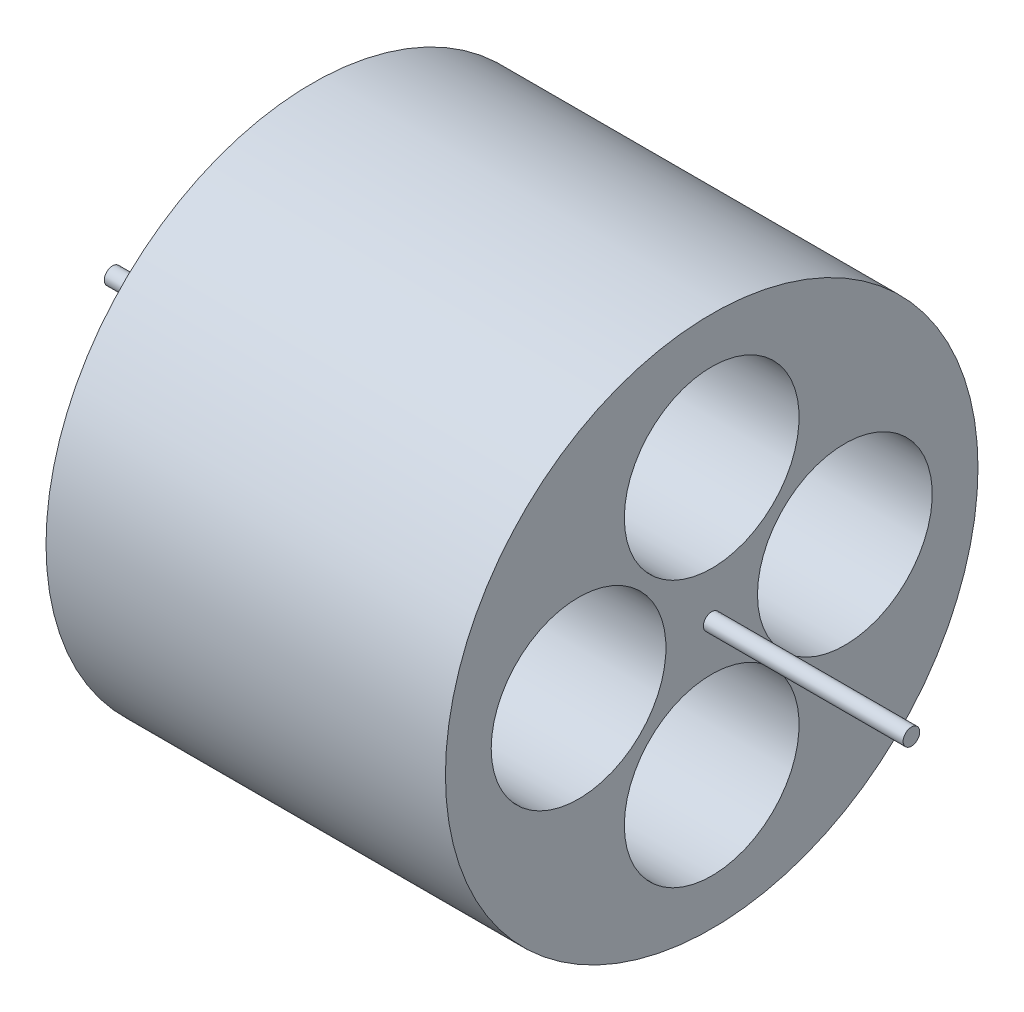
ISO-10303-21;
HEADER;
FILE_DESCRIPTION(('STEP AP214'),'2;1');
FILE_NAME('part.step','',(''),(''),'','','');
FILE_SCHEMA(('AUTOMOTIVE_DESIGN { 1 0 10303 214 1 1 1 1 }'));
ENDSEC;
DATA;
#1=APPLICATION_CONTEXT('core data for automotive mechanical design processes');
#2=APPLICATION_PROTOCOL_DEFINITION('international standard','automotive_design',2000,#1);
#3=PRODUCT_CONTEXT('',#1,'mechanical');
#4=PRODUCT('Part','Part','',(#3));
#5=PRODUCT_RELATED_PRODUCT_CATEGORY('part','',(#4));
#6=PRODUCT_DEFINITION_FORMATION('','',#4);
#7=PRODUCT_DEFINITION_CONTEXT('part definition',#1,'design');
#8=PRODUCT_DEFINITION('design','',#6,#7);
#9=PRODUCT_DEFINITION_SHAPE('','',#8);
#10=(LENGTH_UNIT() NAMED_UNIT(*) SI_UNIT(.MILLI.,.METRE.));
#11=(NAMED_UNIT(*) PLANE_ANGLE_UNIT() SI_UNIT($,.RADIAN.));
#12=(NAMED_UNIT(*) SI_UNIT($,.STERADIAN.) SOLID_ANGLE_UNIT());
#13=UNCERTAINTY_MEASURE_WITH_UNIT(LENGTH_MEASURE(1.E-05),#10,'distance_accuracy_value','');
#14=(GEOMETRIC_REPRESENTATION_CONTEXT(3) GLOBAL_UNCERTAINTY_ASSIGNED_CONTEXT((#13)) GLOBAL_UNIT_ASSIGNED_CONTEXT((#10,
#11,#12)) REPRESENTATION_CONTEXT('',''));
#15=CARTESIAN_POINT('',(0.,0.,0.));
#16=DIRECTION('',(0.,0.,1.));
#17=DIRECTION('',(1.,0.,0.));
#18=AXIS2_PLACEMENT_3D('',#15,#16,#17);
#19=CARTESIAN_POINT('',(152.4,0.,0.));
#20=DIRECTION('',(-1.,0.,0.));
#21=DIRECTION('',(0.,0.,1.));
#22=AXIS2_PLACEMENT_3D('',#19,#20,#21);
#23=CYLINDRICAL_SURFACE('',#22,101.6);
#24=CARTESIAN_POINT('',(152.4,0.,0.));
#25=DIRECTION('',(1.,0.,0.));
#26=DIRECTION('',(0.,0.,-1.));
#27=AXIS2_PLACEMENT_3D('',#24,#25,#26);
#28=CIRCLE('',#27,101.6);
#29=CARTESIAN_POINT('',(152.4,0.,101.6));
#30=VERTEX_POINT('',#29);
#31=EDGE_CURVE('E39',#30,#30,#28,.T.);
#32=CARTESIAN_POINT('',(0.,0.,0.));
#33=DIRECTION('',(1.,0.,0.));
#34=DIRECTION('',(0.,0.,-1.));
#35=AXIS2_PLACEMENT_3D('',#32,#33,#34);
#36=CIRCLE('',#35,101.6);
#37=CARTESIAN_POINT('',(0.,0.,101.6));
#38=VERTEX_POINT('',#37);
#39=EDGE_CURVE('E43',#38,#38,#36,.T.);
#40=CARTESIAN_POINT('',(152.4,0.,101.6));
#41=CARTESIAN_POINT('',(150.8125,0.,101.6));
#42=CARTESIAN_POINT('',(149.225,0.,101.6));
#43=CARTESIAN_POINT('',(146.05,0.,101.6));
#44=CARTESIAN_POINT('',(144.4625,0.,101.6));
#45=CARTESIAN_POINT('',(141.2875,0.,101.6));
#46=CARTESIAN_POINT('',(139.7,0.,101.6));
#47=CARTESIAN_POINT('',(136.525,0.,101.6));
#48=CARTESIAN_POINT('',(134.9375,0.,101.6));
#49=CARTESIAN_POINT('',(131.7625,0.,101.6));
#50=CARTESIAN_POINT('',(130.175,0.,101.6));
#51=CARTESIAN_POINT('',(127.,0.,101.6));
#52=CARTESIAN_POINT('',(125.4125,0.,101.6));
#53=CARTESIAN_POINT('',(122.2375,0.,101.6));
#54=CARTESIAN_POINT('',(120.65,0.,101.6));
#55=CARTESIAN_POINT('',(117.475,0.,101.6));
#56=CARTESIAN_POINT('',(115.8875,0.,101.6));
#57=CARTESIAN_POINT('',(112.7125,0.,101.6));
#58=CARTESIAN_POINT('',(111.125,0.,101.6));
#59=CARTESIAN_POINT('',(107.95,0.,101.6));
#60=CARTESIAN_POINT('',(106.3625,0.,101.6));
#61=CARTESIAN_POINT('',(103.1875,0.,101.6));
#62=CARTESIAN_POINT('',(101.6,0.,101.6));
#63=CARTESIAN_POINT('',(98.425,0.,101.6));
#64=CARTESIAN_POINT('',(96.8375,0.,101.6));
#65=CARTESIAN_POINT('',(93.6625,0.,101.6));
#66=CARTESIAN_POINT('',(92.075,0.,101.6));
#67=CARTESIAN_POINT('',(88.9,0.,101.6));
#68=CARTESIAN_POINT('',(87.3125,0.,101.6));
#69=CARTESIAN_POINT('',(84.1375,0.,101.6));
#70=CARTESIAN_POINT('',(82.55,0.,101.6));
#71=CARTESIAN_POINT('',(79.375,0.,101.6));
#72=CARTESIAN_POINT('',(77.7875,0.,101.6));
#73=CARTESIAN_POINT('',(74.6125,0.,101.6));
#74=CARTESIAN_POINT('',(73.025,0.,101.6));
#75=CARTESIAN_POINT('',(69.85,0.,101.6));
#76=CARTESIAN_POINT('',(68.2625,0.,101.6));
#77=CARTESIAN_POINT('',(65.0875,0.,101.6));
#78=CARTESIAN_POINT('',(63.5,0.,101.6));
#79=CARTESIAN_POINT('',(60.325,0.,101.6));
#80=CARTESIAN_POINT('',(58.7375,0.,101.6));
#81=CARTESIAN_POINT('',(55.5625,0.,101.6));
#82=CARTESIAN_POINT('',(53.975,0.,101.6));
#83=CARTESIAN_POINT('',(50.8,0.,101.6));
#84=CARTESIAN_POINT('',(49.2125,0.,101.6));
#85=CARTESIAN_POINT('',(46.0375,0.,101.6));
#86=CARTESIAN_POINT('',(44.45,0.,101.6));
#87=CARTESIAN_POINT('',(41.275,0.,101.6));
#88=CARTESIAN_POINT('',(39.6875,0.,101.6));
#89=CARTESIAN_POINT('',(36.5125,0.,101.6));
#90=CARTESIAN_POINT('',(34.925,0.,101.6));
#91=CARTESIAN_POINT('',(31.75,0.,101.6));
#92=CARTESIAN_POINT('',(30.1625,0.,101.6));
#93=CARTESIAN_POINT('',(26.9875,0.,101.6));
#94=CARTESIAN_POINT('',(25.4,0.,101.6));
#95=CARTESIAN_POINT('',(22.225,0.,101.6));
#96=CARTESIAN_POINT('',(20.6375,0.,101.6));
#97=CARTESIAN_POINT('',(17.4625,0.,101.6));
#98=CARTESIAN_POINT('',(15.875,0.,101.6));
#99=CARTESIAN_POINT('',(12.7,0.,101.6));
#100=CARTESIAN_POINT('',(11.1125,0.,101.6));
#101=CARTESIAN_POINT('',(7.93750000000001,0.,101.6));
#102=CARTESIAN_POINT('',(6.35,0.,101.6));
#103=CARTESIAN_POINT('',(3.175,0.,101.6));
#104=CARTESIAN_POINT('',(1.5875,0.,101.6));
#105=CARTESIAN_POINT('',(0.,0.,101.6));
#106=B_SPLINE_CURVE_WITH_KNOTS('',3,(#40,#41,#42,#43,#44,#45,#46,#47,#48,#49,#50,#51,#52,#53,
#54,#55,#56,#57,#58,#59,#60,#61,#62,#63,#64,#65,#66,#67,#68,#69,#70,#71,#72,#73,#74,#75,#76,#77,
#78,#79,#80,#81,#82,#83,#84,#85,#86,#87,#88,#89,#90,#91,#92,#93,#94,#95,#96,#97,#98,#99,#100,
#101,#102,#103,#104,#105),.UNSPECIFIED.,.F.,.F.,(4,2,2,2,2,2,2,2,2,2,2,2,2,2,2,2,2,2,2,2,2,2,2,
2,2,2,2,2,2,2,2,2,4),(0.,4.76249999999998,9.52499999999998,14.2875,19.05,23.8125,28.575,33.3375,
38.1,42.8625,47.625,52.3875,57.15,61.9125,66.675,71.4375,76.2,80.9625,85.725,90.4875,95.25,
100.0125,104.775,109.5375,114.3,119.0625,123.825,128.5875,133.35,138.1125,142.875,147.6375,
152.4),.UNSPECIFIED.);
#107=EDGE_CURVE('BSEAM33',#30,#38,#106,.T.);
#108=ORIENTED_EDGE('',*,*,#31,.F.);
#109=ORIENTED_EDGE('',*,*,#39,.T.);
#110=ORIENTED_EDGE('',*,*,#107,.T.);
#111=ORIENTED_EDGE('',*,*,#107,.F.);
#112=EDGE_LOOP('',(#108,#110,#109,#111));
#113=FACE_BOUND('',#112,.T.);
#114=ADVANCED_FACE('F33',(#113),#23,.T.);
#115=CARTESIAN_POINT('',(152.4,0.,0.));
#116=DIRECTION('',(1.,0.,0.));
#117=DIRECTION('',(0.,0.,-1.));
#118=AXIS2_PLACEMENT_3D('',#115,#116,#117);
#119=PLANE('',#118);
#120=CARTESIAN_POINT('',(152.4,0.,0.));
#121=DIRECTION('',(1.,0.,0.));
#122=DIRECTION('',(0.,0.,-1.));
#123=AXIS2_PLACEMENT_3D('',#120,#121,#122);
#124=CIRCLE('',#123,3.175);
#125=CARTESIAN_POINT('',(152.4,0.,-3.175));
#126=VERTEX_POINT('',#125);
#127=EDGE_CURVE('E71',#126,#126,#124,.F.);
#128=ORIENTED_EDGE('',*,*,#127,.T.);
#129=EDGE_LOOP('',(#128));
#130=FACE_BOUND('',#129,.T.);
#131=CARTESIAN_POINT('',(152.4,0.,50.8));
#132=DIRECTION('',(1.,0.,0.));
#133=DIRECTION('',(0.,0.,1.));
#134=AXIS2_PLACEMENT_3D('',#131,#132,#133);
#135=CIRCLE('',#134,33.3375);
#136=CARTESIAN_POINT('',(152.4,0.,84.1375));
#137=VERTEX_POINT('',#136);
#138=EDGE_CURVE('E59',#137,#137,#135,.T.);
#139=ORIENTED_EDGE('',*,*,#138,.F.);
#140=EDGE_LOOP('',(#139));
#141=FACE_BOUND('',#140,.T.);
#142=CARTESIAN_POINT('',(152.4,-50.8,-5.32101756039693E-13));
#143=DIRECTION('',(1.,0.,0.));
#144=DIRECTION('',(0.,-1.,0.));
#145=AXIS2_PLACEMENT_3D('',#142,#143,#144);
#146=CIRCLE('',#145,33.3375);
#147=CARTESIAN_POINT('',(152.4,-50.8,33.3374999999995));
#148=VERTEX_POINT('',#147);
#149=EDGE_CURVE('E65',#148,#148,#146,.T.);
#150=ORIENTED_EDGE('',*,*,#149,.F.);
#151=EDGE_LOOP('',(#150));
#152=FACE_BOUND('',#151,.T.);
#153=CARTESIAN_POINT('',(152.4,50.8,1.77367252013231E-13));
#154=DIRECTION('',(1.,0.,0.));
#155=DIRECTION('',(0.,1.,0.));
#156=AXIS2_PLACEMENT_3D('',#153,#154,#155);
#157=CIRCLE('',#156,33.3375);
#158=CARTESIAN_POINT('',(152.4,50.8,33.3375000000002));
#159=VERTEX_POINT('',#158);
#160=EDGE_CURVE('E53',#159,#159,#157,.T.);
#161=ORIENTED_EDGE('',*,*,#160,.F.);
#162=EDGE_LOOP('',(#161));
#163=FACE_BOUND('',#162,.T.);
#164=CARTESIAN_POINT('',(152.4,0.,-50.8));
#165=DIRECTION('',(1.,0.,0.));
#166=DIRECTION('',(0.,0.,-1.));
#167=AXIS2_PLACEMENT_3D('',#164,#165,#166);
#168=CIRCLE('',#167,33.3375);
#169=CARTESIAN_POINT('',(152.4,0.,-17.4625));
#170=VERTEX_POINT('',#169);
#171=EDGE_CURVE('E48',#170,#170,#168,.T.);
#172=ORIENTED_EDGE('',*,*,#171,.F.);
#173=EDGE_LOOP('',(#172));
#174=FACE_BOUND('',#173,.T.);
#175=ORIENTED_EDGE('',*,*,#31,.T.);
#176=EDGE_LOOP('',(#175));
#177=FACE_BOUND('',#176,.T.);
#178=ADVANCED_FACE('F100',(#130,#141,#152,#163,#174,#177),#119,.T.);
#179=CARTESIAN_POINT('',(0.,0.,0.));
#180=DIRECTION('',(1.,0.,0.));
#181=DIRECTION('',(0.,0.,-1.));
#182=AXIS2_PLACEMENT_3D('',#179,#180,#181);
#183=PLANE('',#182);
#184=CARTESIAN_POINT('',(0.,0.,0.));
#185=DIRECTION('',(1.,0.,0.));
#186=DIRECTION('',(0.,0.,-1.));
#187=AXIS2_PLACEMENT_3D('',#184,#185,#186);
#188=CIRCLE('',#187,3.175);
#189=CARTESIAN_POINT('',(0.,0.,-3.175));
#190=VERTEX_POINT('',#189);
#191=EDGE_CURVE('E10',#190,#190,#188,.F.);
#192=ORIENTED_EDGE('',*,*,#191,.F.);
#193=EDGE_LOOP('',(#192));
#194=FACE_BOUND('',#193,.T.);
#195=CARTESIAN_POINT('',(0.,0.,50.8));
#196=DIRECTION('',(1.,0.,0.));
#197=DIRECTION('',(0.,0.,1.));
#198=AXIS2_PLACEMENT_3D('',#195,#196,#197);
#199=CIRCLE('',#198,33.3375);
#200=CARTESIAN_POINT('',(0.,0.,84.1375));
#201=VERTEX_POINT('',#200);
#202=EDGE_CURVE('E62',#201,#201,#199,.T.);
#203=ORIENTED_EDGE('',*,*,#202,.T.);
#204=EDGE_LOOP('',(#203));
#205=FACE_BOUND('',#204,.T.);
#206=CARTESIAN_POINT('',(0.,-50.8,-5.32101756039693E-13));
#207=DIRECTION('',(1.,0.,0.));
#208=DIRECTION('',(0.,-1.,0.));
#209=AXIS2_PLACEMENT_3D('',#206,#207,#208);
#210=CIRCLE('',#209,33.3375);
#211=CARTESIAN_POINT('',(0.,-50.8,33.3374999999995));
#212=VERTEX_POINT('',#211);
#213=EDGE_CURVE('E68',#212,#212,#210,.T.);
#214=ORIENTED_EDGE('',*,*,#213,.T.);
#215=EDGE_LOOP('',(#214));
#216=FACE_BOUND('',#215,.T.);
#217=CARTESIAN_POINT('',(0.,50.8,1.77367252013231E-13));
#218=DIRECTION('',(1.,0.,0.));
#219=DIRECTION('',(0.,1.,0.));
#220=AXIS2_PLACEMENT_3D('',#217,#218,#219);
#221=CIRCLE('',#220,33.3375);
#222=CARTESIAN_POINT('',(0.,50.8,33.3375000000002));
#223=VERTEX_POINT('',#222);
#224=EDGE_CURVE('E56',#223,#223,#221,.T.);
#225=ORIENTED_EDGE('',*,*,#224,.T.);
#226=EDGE_LOOP('',(#225));
#227=FACE_BOUND('',#226,.T.);
#228=CARTESIAN_POINT('',(0.,0.,-50.8));
#229=DIRECTION('',(1.,0.,0.));
#230=DIRECTION('',(0.,0.,-1.));
#231=AXIS2_PLACEMENT_3D('',#228,#229,#230);
#232=CIRCLE('',#231,33.3375);
#233=CARTESIAN_POINT('',(0.,0.,-17.4625));
#234=VERTEX_POINT('',#233);
#235=EDGE_CURVE('E50',#234,#234,#232,.T.);
#236=ORIENTED_EDGE('',*,*,#235,.T.);
#237=EDGE_LOOP('',(#236));
#238=FACE_BOUND('',#237,.T.);
#239=ORIENTED_EDGE('',*,*,#39,.F.);
#240=EDGE_LOOP('',(#239));
#241=FACE_BOUND('',#240,.T.);
#242=ADVANCED_FACE('F105',(#194,#205,#216,#227,#238,#241),#183,.F.);
#243=CARTESIAN_POINT('',(152.4,0.,-50.8));
#244=DIRECTION('',(-1.,0.,0.));
#245=DIRECTION('',(0.,0.,1.));
#246=AXIS2_PLACEMENT_3D('',#243,#244,#245);
#247=CYLINDRICAL_SURFACE('',#246,33.3375);
#248=CARTESIAN_POINT('',(152.4,0.,-17.4625));
#249=CARTESIAN_POINT('',(150.8125,0.,-17.4625));
#250=CARTESIAN_POINT('',(149.225,0.,-17.4625));
#251=CARTESIAN_POINT('',(146.05,0.,-17.4625));
#252=CARTESIAN_POINT('',(144.4625,0.,-17.4625));
#253=CARTESIAN_POINT('',(141.2875,0.,-17.4625));
#254=CARTESIAN_POINT('',(139.7,0.,-17.4625));
#255=CARTESIAN_POINT('',(136.525,0.,-17.4625));
#256=CARTESIAN_POINT('',(134.9375,0.,-17.4625));
#257=CARTESIAN_POINT('',(131.7625,0.,-17.4625));
#258=CARTESIAN_POINT('',(130.175,0.,-17.4625));
#259=CARTESIAN_POINT('',(127.,0.,-17.4625));
#260=CARTESIAN_POINT('',(125.4125,0.,-17.4625));
#261=CARTESIAN_POINT('',(122.2375,0.,-17.4625));
#262=CARTESIAN_POINT('',(120.65,0.,-17.4625));
#263=CARTESIAN_POINT('',(117.475,0.,-17.4625));
#264=CARTESIAN_POINT('',(115.8875,0.,-17.4625));
#265=CARTESIAN_POINT('',(112.7125,0.,-17.4625));
#266=CARTESIAN_POINT('',(111.125,0.,-17.4625));
#267=CARTESIAN_POINT('',(107.95,0.,-17.4625));
#268=CARTESIAN_POINT('',(106.3625,0.,-17.4625));
#269=CARTESIAN_POINT('',(103.1875,0.,-17.4625));
#270=CARTESIAN_POINT('',(101.6,0.,-17.4625));
#271=CARTESIAN_POINT('',(98.425,0.,-17.4625));
#272=CARTESIAN_POINT('',(96.8375,0.,-17.4625));
#273=CARTESIAN_POINT('',(93.6625,0.,-17.4625));
#274=CARTESIAN_POINT('',(92.075,0.,-17.4625));
#275=CARTESIAN_POINT('',(88.9,0.,-17.4625));
#276=CARTESIAN_POINT('',(87.3125,0.,-17.4625));
#277=CARTESIAN_POINT('',(84.1375,0.,-17.4625));
#278=CARTESIAN_POINT('',(82.55,0.,-17.4625));
#279=CARTESIAN_POINT('',(79.375,0.,-17.4625));
#280=CARTESIAN_POINT('',(77.7875,0.,-17.4625));
#281=CARTESIAN_POINT('',(74.6125,0.,-17.4625));
#282=CARTESIAN_POINT('',(73.025,0.,-17.4625));
#283=CARTESIAN_POINT('',(69.85,0.,-17.4625));
#284=CARTESIAN_POINT('',(68.2625,0.,-17.4625));
#285=CARTESIAN_POINT('',(65.0875,0.,-17.4625));
#286=CARTESIAN_POINT('',(63.5,0.,-17.4625));
#287=CARTESIAN_POINT('',(60.325,0.,-17.4625));
#288=CARTESIAN_POINT('',(58.7375,0.,-17.4625));
#289=CARTESIAN_POINT('',(55.5625,0.,-17.4625));
#290=CARTESIAN_POINT('',(53.975,0.,-17.4625));
#291=CARTESIAN_POINT('',(50.8,0.,-17.4625));
#292=CARTESIAN_POINT('',(49.2125,0.,-17.4625));
#293=CARTESIAN_POINT('',(46.0375,0.,-17.4625));
#294=CARTESIAN_POINT('',(44.45,0.,-17.4625));
#295=CARTESIAN_POINT('',(41.275,0.,-17.4625));
#296=CARTESIAN_POINT('',(39.6875,0.,-17.4625));
#297=CARTESIAN_POINT('',(36.5125,0.,-17.4625));
#298=CARTESIAN_POINT('',(34.925,0.,-17.4625));
#299=CARTESIAN_POINT('',(31.75,0.,-17.4625));
#300=CARTESIAN_POINT('',(30.1625,0.,-17.4625));
#301=CARTESIAN_POINT('',(26.9875,0.,-17.4625));
#302=CARTESIAN_POINT('',(25.4,0.,-17.4625));
#303=CARTESIAN_POINT('',(22.225,0.,-17.4625));
#304=CARTESIAN_POINT('',(20.6375,0.,-17.4625));
#305=CARTESIAN_POINT('',(17.4625,0.,-17.4625));
#306=CARTESIAN_POINT('',(15.875,0.,-17.4625));
#307=CARTESIAN_POINT('',(12.7,0.,-17.4625));
#308=CARTESIAN_POINT('',(11.1125,0.,-17.4625));
#309=CARTESIAN_POINT('',(7.93750000000001,0.,-17.4625));
#310=CARTESIAN_POINT('',(6.35,0.,-17.4625));
#311=CARTESIAN_POINT('',(3.175,0.,-17.4625));
#312=CARTESIAN_POINT('',(1.5875,0.,-17.4625));
#313=CARTESIAN_POINT('',(0.,0.,-17.4625));
#314=B_SPLINE_CURVE_WITH_KNOTS('',3,(#248,#249,#250,#251,#252,#253,#254,#255,#256,#257,#258,
#259,#260,#261,#262,#263,#264,#265,#266,#267,#268,#269,#270,#271,#272,#273,#274,#275,#276,#277,
#278,#279,#280,#281,#282,#283,#284,#285,#286,#287,#288,#289,#290,#291,#292,#293,#294,#295,#296,
#297,#298,#299,#300,#301,#302,#303,#304,#305,#306,#307,#308,#309,#310,#311,#312,#313),
.UNSPECIFIED.,.F.,.F.,(4,2,2,2,2,2,2,2,2,2,2,2,2,2,2,2,2,2,2,2,2,2,2,2,2,2,2,2,2,2,2,2,4),(0.,
4.7625,9.52500000000001,14.2875,19.05,23.8125,28.575,33.3375,38.1,42.8625,47.625,52.3875,57.15,
61.9125,66.675,71.4375,76.2,80.9625,85.725,90.4875,95.25,100.0125,104.775,109.5375,114.3,
119.0625,123.825,128.5875,133.35,138.1125,142.875,147.6375,152.4),.UNSPECIFIED.);
#315=EDGE_CURVE('BSEAM112',#170,#234,#314,.T.);
#316=ORIENTED_EDGE('',*,*,#171,.T.);
#317=ORIENTED_EDGE('',*,*,#235,.F.);
#318=ORIENTED_EDGE('',*,*,#315,.T.);
#319=ORIENTED_EDGE('',*,*,#315,.F.);
#320=EDGE_LOOP('',(#316,#318,#317,#319));
#321=FACE_BOUND('',#320,.T.);
#322=ADVANCED_FACE('F112',(#321),#247,.F.);
#323=CARTESIAN_POINT('',(152.4,50.8,1.77367252013231E-13));
#324=DIRECTION('',(-1.,0.,0.));
#325=DIRECTION('',(0.,0.,1.));
#326=AXIS2_PLACEMENT_3D('',#323,#324,#325);
#327=CYLINDRICAL_SURFACE('',#326,33.3375);
#328=CARTESIAN_POINT('',(152.4,50.8,33.3375000000002));
#329=CARTESIAN_POINT('',(150.8125,50.8,33.3375000000002));
#330=CARTESIAN_POINT('',(149.225,50.8,33.3375000000002));
#331=CARTESIAN_POINT('',(146.05,50.8,33.3375000000002));
#332=CARTESIAN_POINT('',(144.4625,50.8,33.3375000000002));
#333=CARTESIAN_POINT('',(141.2875,50.8,33.3375000000002));
#334=CARTESIAN_POINT('',(139.7,50.8,33.3375000000002));
#335=CARTESIAN_POINT('',(136.525,50.8,33.3375000000002));
#336=CARTESIAN_POINT('',(134.9375,50.8,33.3375000000002));
#337=CARTESIAN_POINT('',(131.7625,50.8,33.3375000000002));
#338=CARTESIAN_POINT('',(130.175,50.8,33.3375000000002));
#339=CARTESIAN_POINT('',(127.,50.8,33.3375000000002));
#340=CARTESIAN_POINT('',(125.4125,50.8,33.3375000000002));
#341=CARTESIAN_POINT('',(122.2375,50.8,33.3375000000002));
#342=CARTESIAN_POINT('',(120.65,50.8,33.3375000000002));
#343=CARTESIAN_POINT('',(117.475,50.8,33.3375000000002));
#344=CARTESIAN_POINT('',(115.8875,50.8,33.3375000000002));
#345=CARTESIAN_POINT('',(112.7125,50.8,33.3375000000002));
#346=CARTESIAN_POINT('',(111.125,50.8,33.3375000000002));
#347=CARTESIAN_POINT('',(107.95,50.8,33.3375000000002));
#348=CARTESIAN_POINT('',(106.3625,50.8,33.3375000000002));
#349=CARTESIAN_POINT('',(103.1875,50.8,33.3375000000002));
#350=CARTESIAN_POINT('',(101.6,50.8,33.3375000000002));
#351=CARTESIAN_POINT('',(98.425,50.8,33.3375000000002));
#352=CARTESIAN_POINT('',(96.8375,50.8,33.3375000000002));
#353=CARTESIAN_POINT('',(93.6625,50.8,33.3375000000002));
#354=CARTESIAN_POINT('',(92.075,50.8,33.3375000000002));
#355=CARTESIAN_POINT('',(88.9,50.8,33.3375000000002));
#356=CARTESIAN_POINT('',(87.3125,50.8,33.3375000000002));
#357=CARTESIAN_POINT('',(84.1375,50.8,33.3375000000002));
#358=CARTESIAN_POINT('',(82.55,50.8,33.3375000000002));
#359=CARTESIAN_POINT('',(79.375,50.8,33.3375000000002));
#360=CARTESIAN_POINT('',(77.7875,50.8,33.3375000000002));
#361=CARTESIAN_POINT('',(74.6125,50.8,33.3375000000002));
#362=CARTESIAN_POINT('',(73.025,50.8,33.3375000000002));
#363=CARTESIAN_POINT('',(69.85,50.8,33.3375000000002));
#364=CARTESIAN_POINT('',(68.2625,50.8,33.3375000000002));
#365=CARTESIAN_POINT('',(65.0875,50.8,33.3375000000002));
#366=CARTESIAN_POINT('',(63.5,50.8,33.3375000000002));
#367=CARTESIAN_POINT('',(60.325,50.8,33.3375000000002));
#368=CARTESIAN_POINT('',(58.7375,50.8,33.3375000000002));
#369=CARTESIAN_POINT('',(55.5625,50.8,33.3375000000002));
#370=CARTESIAN_POINT('',(53.975,50.8,33.3375000000002));
#371=CARTESIAN_POINT('',(50.8,50.8,33.3375000000002));
#372=CARTESIAN_POINT('',(49.2125,50.8,33.3375000000002));
#373=CARTESIAN_POINT('',(46.0375,50.8,33.3375000000002));
#374=CARTESIAN_POINT('',(44.45,50.8,33.3375000000002));
#375=CARTESIAN_POINT('',(41.275,50.8,33.3375000000002));
#376=CARTESIAN_POINT('',(39.6875,50.8,33.3375000000002));
#377=CARTESIAN_POINT('',(36.5125,50.8,33.3375000000002));
#378=CARTESIAN_POINT('',(34.925,50.8,33.3375000000002));
#379=CARTESIAN_POINT('',(31.75,50.8,33.3375000000002));
#380=CARTESIAN_POINT('',(30.1625,50.8,33.3375000000002));
#381=CARTESIAN_POINT('',(26.9875,50.8,33.3375000000002));
#382=CARTESIAN_POINT('',(25.4,50.8,33.3375000000002));
#383=CARTESIAN_POINT('',(22.225,50.8,33.3375000000002));
#384=CARTESIAN_POINT('',(20.6375,50.8,33.3375000000002));
#385=CARTESIAN_POINT('',(17.4625,50.8,33.3375000000002));
#386=CARTESIAN_POINT('',(15.875,50.8,33.3375000000002));
#387=CARTESIAN_POINT('',(12.7,50.8,33.3375000000002));
#388=CARTESIAN_POINT('',(11.1125,50.8,33.3375000000002));
#389=CARTESIAN_POINT('',(7.93750000000001,50.8,33.3375000000002));
#390=CARTESIAN_POINT('',(6.35,50.8,33.3375000000002));
#391=CARTESIAN_POINT('',(3.175,50.8,33.3375000000002));
#392=CARTESIAN_POINT('',(1.5875,50.8,33.3375000000002));
#393=CARTESIAN_POINT('',(0.,50.8,33.3375000000002));
#394=B_SPLINE_CURVE_WITH_KNOTS('',3,(#328,#329,#330,#331,#332,#333,#334,#335,#336,#337,#338,
#339,#340,#341,#342,#343,#344,#345,#346,#347,#348,#349,#350,#351,#352,#353,#354,#355,#356,#357,
#358,#359,#360,#361,#362,#363,#364,#365,#366,#367,#368,#369,#370,#371,#372,#373,#374,#375,#376,
#377,#378,#379,#380,#381,#382,#383,#384,#385,#386,#387,#388,#389,#390,#391,#392,#393),
.UNSPECIFIED.,.F.,.F.,(4,2,2,2,2,2,2,2,2,2,2,2,2,2,2,2,2,2,2,2,2,2,2,2,2,2,2,2,2,2,2,2,4),(0.,
4.7625,9.52500000000001,14.2875,19.05,23.8125,28.575,33.3375,38.1,42.8625,47.625,52.3875,57.15,
61.9125,66.675,71.4375,76.2,80.9625,85.725,90.4875,95.25,100.0125,104.775,109.5375,114.3,
119.0625,123.825,128.5875,133.35,138.1125,142.875,147.6375,152.4),.UNSPECIFIED.);
#395=EDGE_CURVE('BSEAM117',#159,#223,#394,.T.);
#396=ORIENTED_EDGE('',*,*,#160,.T.);
#397=ORIENTED_EDGE('',*,*,#224,.F.);
#398=ORIENTED_EDGE('',*,*,#395,.T.);
#399=ORIENTED_EDGE('',*,*,#395,.F.);
#400=EDGE_LOOP('',(#396,#398,#397,#399));
#401=FACE_BOUND('',#400,.T.);
#402=ADVANCED_FACE('F117',(#401),#327,.F.);
#403=CARTESIAN_POINT('',(152.4,-50.8,-5.32101756039693E-13));
#404=DIRECTION('',(-1.,0.,0.));
#405=DIRECTION('',(0.,0.,1.));
#406=AXIS2_PLACEMENT_3D('',#403,#404,#405);
#407=CYLINDRICAL_SURFACE('',#406,33.3375);
#408=CARTESIAN_POINT('',(152.4,-50.8,33.3374999999995));
#409=CARTESIAN_POINT('',(150.8125,-50.8,33.3374999999995));
#410=CARTESIAN_POINT('',(149.225,-50.8,33.3374999999995));
#411=CARTESIAN_POINT('',(146.05,-50.8,33.3374999999995));
#412=CARTESIAN_POINT('',(144.4625,-50.8,33.3374999999995));
#413=CARTESIAN_POINT('',(141.2875,-50.8,33.3374999999995));
#414=CARTESIAN_POINT('',(139.7,-50.8,33.3374999999995));
#415=CARTESIAN_POINT('',(136.525,-50.8,33.3374999999995));
#416=CARTESIAN_POINT('',(134.9375,-50.8,33.3374999999995));
#417=CARTESIAN_POINT('',(131.7625,-50.8,33.3374999999995));
#418=CARTESIAN_POINT('',(130.175,-50.8,33.3374999999995));
#419=CARTESIAN_POINT('',(127.,-50.8,33.3374999999995));
#420=CARTESIAN_POINT('',(125.4125,-50.8,33.3374999999995));
#421=CARTESIAN_POINT('',(122.2375,-50.8,33.3374999999995));
#422=CARTESIAN_POINT('',(120.65,-50.8,33.3374999999995));
#423=CARTESIAN_POINT('',(117.475,-50.8,33.3374999999995));
#424=CARTESIAN_POINT('',(115.8875,-50.8,33.3374999999995));
#425=CARTESIAN_POINT('',(112.7125,-50.8,33.3374999999995));
#426=CARTESIAN_POINT('',(111.125,-50.8,33.3374999999995));
#427=CARTESIAN_POINT('',(107.95,-50.8,33.3374999999995));
#428=CARTESIAN_POINT('',(106.3625,-50.8,33.3374999999995));
#429=CARTESIAN_POINT('',(103.1875,-50.8,33.3374999999995));
#430=CARTESIAN_POINT('',(101.6,-50.8,33.3374999999995));
#431=CARTESIAN_POINT('',(98.425,-50.8,33.3374999999995));
#432=CARTESIAN_POINT('',(96.8375,-50.8,33.3374999999995));
#433=CARTESIAN_POINT('',(93.6625,-50.8,33.3374999999995));
#434=CARTESIAN_POINT('',(92.075,-50.8,33.3374999999995));
#435=CARTESIAN_POINT('',(88.9,-50.8,33.3374999999995));
#436=CARTESIAN_POINT('',(87.3125,-50.8,33.3374999999995));
#437=CARTESIAN_POINT('',(84.1375,-50.8,33.3374999999995));
#438=CARTESIAN_POINT('',(82.55,-50.8,33.3374999999995));
#439=CARTESIAN_POINT('',(79.375,-50.8,33.3374999999995));
#440=CARTESIAN_POINT('',(77.7875,-50.8,33.3374999999995));
#441=CARTESIAN_POINT('',(74.6125,-50.8,33.3374999999995));
#442=CARTESIAN_POINT('',(73.025,-50.8,33.3374999999995));
#443=CARTESIAN_POINT('',(69.85,-50.8,33.3374999999995));
#444=CARTESIAN_POINT('',(68.2625,-50.8,33.3374999999995));
#445=CARTESIAN_POINT('',(65.0875,-50.8,33.3374999999995));
#446=CARTESIAN_POINT('',(63.5,-50.8,33.3374999999995));
#447=CARTESIAN_POINT('',(60.325,-50.8,33.3374999999995));
#448=CARTESIAN_POINT('',(58.7375,-50.8,33.3374999999995));
#449=CARTESIAN_POINT('',(55.5625,-50.8,33.3374999999995));
#450=CARTESIAN_POINT('',(53.975,-50.8,33.3374999999995));
#451=CARTESIAN_POINT('',(50.8,-50.8,33.3374999999995));
#452=CARTESIAN_POINT('',(49.2125,-50.8,33.3374999999995));
#453=CARTESIAN_POINT('',(46.0375,-50.8,33.3374999999995));
#454=CARTESIAN_POINT('',(44.45,-50.8,33.3374999999995));
#455=CARTESIAN_POINT('',(41.275,-50.8,33.3374999999995));
#456=CARTESIAN_POINT('',(39.6875,-50.8,33.3374999999995));
#457=CARTESIAN_POINT('',(36.5125,-50.8,33.3374999999995));
#458=CARTESIAN_POINT('',(34.925,-50.8,33.3374999999995));
#459=CARTESIAN_POINT('',(31.75,-50.8,33.3374999999995));
#460=CARTESIAN_POINT('',(30.1625,-50.8,33.3374999999995));
#461=CARTESIAN_POINT('',(26.9875,-50.8,33.3374999999995));
#462=CARTESIAN_POINT('',(25.4,-50.8,33.3374999999995));
#463=CARTESIAN_POINT('',(22.225,-50.8,33.3374999999995));
#464=CARTESIAN_POINT('',(20.6375,-50.8,33.3374999999995));
#465=CARTESIAN_POINT('',(17.4625,-50.8,33.3374999999995));
#466=CARTESIAN_POINT('',(15.875,-50.8,33.3374999999995));
#467=CARTESIAN_POINT('',(12.7,-50.8,33.3374999999995));
#468=CARTESIAN_POINT('',(11.1125,-50.8,33.3374999999995));
#469=CARTESIAN_POINT('',(7.93750000000001,-50.8,33.3374999999995));
#470=CARTESIAN_POINT('',(6.35,-50.8,33.3374999999995));
#471=CARTESIAN_POINT('',(3.175,-50.8,33.3374999999995));
#472=CARTESIAN_POINT('',(1.5875,-50.8,33.3374999999995));
#473=CARTESIAN_POINT('',(0.,-50.8,33.3374999999995));
#474=B_SPLINE_CURVE_WITH_KNOTS('',3,(#408,#409,#410,#411,#412,#413,#414,#415,#416,#417,#418,
#419,#420,#421,#422,#423,#424,#425,#426,#427,#428,#429,#430,#431,#432,#433,#434,#435,#436,#437,
#438,#439,#440,#441,#442,#443,#444,#445,#446,#447,#448,#449,#450,#451,#452,#453,#454,#455,#456,
#457,#458,#459,#460,#461,#462,#463,#464,#465,#466,#467,#468,#469,#470,#471,#472,#473),
.UNSPECIFIED.,.F.,.F.,(4,2,2,2,2,2,2,2,2,2,2,2,2,2,2,2,2,2,2,2,2,2,2,2,2,2,2,2,2,2,2,2,4),(0.,
4.7625,9.52500000000001,14.2875,19.05,23.8125,28.575,33.3375,38.1,42.8625,47.625,52.3875,57.15,
61.9125,66.675,71.4375,76.2,80.9625,85.725,90.4875,95.25,100.0125,104.775,109.5375,114.3,
119.0625,123.825,128.5875,133.35,138.1125,142.875,147.6375,152.4),.UNSPECIFIED.);
#475=EDGE_CURVE('BSEAM95',#148,#212,#474,.T.);
#476=ORIENTED_EDGE('',*,*,#149,.T.);
#477=ORIENTED_EDGE('',*,*,#213,.F.);
#478=ORIENTED_EDGE('',*,*,#475,.T.);
#479=ORIENTED_EDGE('',*,*,#475,.F.);
#480=EDGE_LOOP('',(#476,#478,#477,#479));
#481=FACE_BOUND('',#480,.T.);
#482=ADVANCED_FACE('F95',(#481),#407,.F.);
#483=CARTESIAN_POINT('',(152.4,0.,50.8));
#484=DIRECTION('',(-1.,0.,0.));
#485=DIRECTION('',(0.,0.,1.));
#486=AXIS2_PLACEMENT_3D('',#483,#484,#485);
#487=CYLINDRICAL_SURFACE('',#486,33.3375);
#488=CARTESIAN_POINT('',(152.4,0.,84.1375));
#489=CARTESIAN_POINT('',(150.8125,0.,84.1375));
#490=CARTESIAN_POINT('',(149.225,0.,84.1375));
#491=CARTESIAN_POINT('',(146.05,0.,84.1375));
#492=CARTESIAN_POINT('',(144.4625,0.,84.1375));
#493=CARTESIAN_POINT('',(141.2875,0.,84.1375));
#494=CARTESIAN_POINT('',(139.7,0.,84.1375));
#495=CARTESIAN_POINT('',(136.525,0.,84.1375));
#496=CARTESIAN_POINT('',(134.9375,0.,84.1375));
#497=CARTESIAN_POINT('',(131.7625,0.,84.1375));
#498=CARTESIAN_POINT('',(130.175,0.,84.1375));
#499=CARTESIAN_POINT('',(127.,0.,84.1375));
#500=CARTESIAN_POINT('',(125.4125,0.,84.1375));
#501=CARTESIAN_POINT('',(122.2375,0.,84.1375));
#502=CARTESIAN_POINT('',(120.65,0.,84.1375));
#503=CARTESIAN_POINT('',(117.475,0.,84.1375));
#504=CARTESIAN_POINT('',(115.8875,0.,84.1375));
#505=CARTESIAN_POINT('',(112.7125,0.,84.1375));
#506=CARTESIAN_POINT('',(111.125,0.,84.1375));
#507=CARTESIAN_POINT('',(107.95,0.,84.1375));
#508=CARTESIAN_POINT('',(106.3625,0.,84.1375));
#509=CARTESIAN_POINT('',(103.1875,0.,84.1375));
#510=CARTESIAN_POINT('',(101.6,0.,84.1375));
#511=CARTESIAN_POINT('',(98.425,0.,84.1375));
#512=CARTESIAN_POINT('',(96.8375,0.,84.1375));
#513=CARTESIAN_POINT('',(93.6625,0.,84.1375));
#514=CARTESIAN_POINT('',(92.075,0.,84.1375));
#515=CARTESIAN_POINT('',(88.9,0.,84.1375));
#516=CARTESIAN_POINT('',(87.3125,0.,84.1375));
#517=CARTESIAN_POINT('',(84.1375,0.,84.1375));
#518=CARTESIAN_POINT('',(82.55,0.,84.1375));
#519=CARTESIAN_POINT('',(79.375,0.,84.1375));
#520=CARTESIAN_POINT('',(77.7875,0.,84.1375));
#521=CARTESIAN_POINT('',(74.6125,0.,84.1375));
#522=CARTESIAN_POINT('',(73.025,0.,84.1375));
#523=CARTESIAN_POINT('',(69.85,0.,84.1375));
#524=CARTESIAN_POINT('',(68.2625,0.,84.1375));
#525=CARTESIAN_POINT('',(65.0875,0.,84.1375));
#526=CARTESIAN_POINT('',(63.5,0.,84.1375));
#527=CARTESIAN_POINT('',(60.325,0.,84.1375));
#528=CARTESIAN_POINT('',(58.7375,0.,84.1375));
#529=CARTESIAN_POINT('',(55.5625,0.,84.1375));
#530=CARTESIAN_POINT('',(53.975,0.,84.1375));
#531=CARTESIAN_POINT('',(50.8,0.,84.1375));
#532=CARTESIAN_POINT('',(49.2125,0.,84.1375));
#533=CARTESIAN_POINT('',(46.0375,0.,84.1375));
#534=CARTESIAN_POINT('',(44.45,0.,84.1375));
#535=CARTESIAN_POINT('',(41.275,0.,84.1375));
#536=CARTESIAN_POINT('',(39.6875,0.,84.1375));
#537=CARTESIAN_POINT('',(36.5125,0.,84.1375));
#538=CARTESIAN_POINT('',(34.925,0.,84.1375));
#539=CARTESIAN_POINT('',(31.75,0.,84.1375));
#540=CARTESIAN_POINT('',(30.1625,0.,84.1375));
#541=CARTESIAN_POINT('',(26.9875,0.,84.1375));
#542=CARTESIAN_POINT('',(25.4,0.,84.1375));
#543=CARTESIAN_POINT('',(22.225,0.,84.1375));
#544=CARTESIAN_POINT('',(20.6375,0.,84.1375));
#545=CARTESIAN_POINT('',(17.4625,0.,84.1375));
#546=CARTESIAN_POINT('',(15.875,0.,84.1375));
#547=CARTESIAN_POINT('',(12.7,0.,84.1375));
#548=CARTESIAN_POINT('',(11.1125,0.,84.1375));
#549=CARTESIAN_POINT('',(7.93750000000001,0.,84.1375));
#550=CARTESIAN_POINT('',(6.35,0.,84.1375));
#551=CARTESIAN_POINT('',(3.175,0.,84.1375));
#552=CARTESIAN_POINT('',(1.5875,0.,84.1375));
#553=CARTESIAN_POINT('',(0.,0.,84.1375));
#554=B_SPLINE_CURVE_WITH_KNOTS('',3,(#488,#489,#490,#491,#492,#493,#494,#495,#496,#497,#498,
#499,#500,#501,#502,#503,#504,#505,#506,#507,#508,#509,#510,#511,#512,#513,#514,#515,#516,#517,
#518,#519,#520,#521,#522,#523,#524,#525,#526,#527,#528,#529,#530,#531,#532,#533,#534,#535,#536,
#537,#538,#539,#540,#541,#542,#543,#544,#545,#546,#547,#548,#549,#550,#551,#552,#553),
.UNSPECIFIED.,.F.,.F.,(4,2,2,2,2,2,2,2,2,2,2,2,2,2,2,2,2,2,2,2,2,2,2,2,2,2,2,2,2,2,2,2,4),(0.,
4.7625,9.52500000000001,14.2875,19.05,23.8125,28.575,33.3375,38.1,42.8625,47.625,52.3875,57.15,
61.9125,66.675,71.4375,76.2,80.9625,85.725,90.4875,95.25,100.0125,104.775,109.5375,114.3,
119.0625,123.825,128.5875,133.35,138.1125,142.875,147.6375,152.4),.UNSPECIFIED.);
#555=EDGE_CURVE('BSEAM87',#137,#201,#554,.T.);
#556=ORIENTED_EDGE('',*,*,#138,.T.);
#557=ORIENTED_EDGE('',*,*,#202,.F.);
#558=ORIENTED_EDGE('',*,*,#555,.T.);
#559=ORIENTED_EDGE('',*,*,#555,.F.);
#560=EDGE_LOOP('',(#556,#558,#557,#559));
#561=FACE_BOUND('',#560,.T.);
#562=ADVANCED_FACE('F87',(#561),#487,.F.);
#563=CARTESIAN_POINT('',(-76.2,0.,0.));
#564=DIRECTION('',(1.,0.,0.));
#565=DIRECTION('',(0.,0.,-1.));
#566=AXIS2_PLACEMENT_3D('',#563,#564,#565);
#567=PLANE('',#566);
#568=CARTESIAN_POINT('',(-76.2,0.,0.));
#569=DIRECTION('',(1.,0.,0.));
#570=DIRECTION('',(0.,0.,-1.));
#571=AXIS2_PLACEMENT_3D('',#568,#569,#570);
#572=CIRCLE('',#571,3.175);
#573=CARTESIAN_POINT('',(-76.2,0.,-3.175));
#574=VERTEX_POINT('',#573);
#575=EDGE_CURVE('E79',#574,#574,#572,.T.);
#576=ORIENTED_EDGE('',*,*,#575,.F.);
#577=EDGE_LOOP('',(#576));
#578=FACE_BOUND('',#577,.T.);
#579=ADVANCED_FACE('F85',(#578),#567,.F.);
#580=CARTESIAN_POINT('',(228.6,0.,0.));
#581=DIRECTION('',(-1.,0.,0.));
#582=DIRECTION('',(0.,0.,1.));
#583=AXIS2_PLACEMENT_3D('',#580,#581,#582);
#584=CYLINDRICAL_SURFACE('',#583,3.175);
#585=ORIENTED_EDGE('',*,*,#575,.T.);
#586=EDGE_LOOP('',(#585));
#587=FACE_BOUND('',#586,.T.);
#588=ORIENTED_EDGE('',*,*,#191,.T.);
#589=EDGE_LOOP('',(#588));
#590=FACE_BOUND('',#589,.T.);
#591=ADVANCED_FACE('F83',(#587,#590),#584,.T.);
#592=ORIENTED_EDGE('',*,*,#127,.F.);
#593=EDGE_LOOP('',(#592));
#594=FACE_BOUND('',#593,.T.);
#595=CARTESIAN_POINT('',(228.6,0.,0.));
#596=DIRECTION('',(1.,0.,0.));
#597=DIRECTION('',(0.,0.,-1.));
#598=AXIS2_PLACEMENT_3D('',#595,#596,#597);
#599=CIRCLE('',#598,3.175);
#600=CARTESIAN_POINT('',(228.6,0.,-3.175));
#601=VERTEX_POINT('',#600);
#602=EDGE_CURVE('E76',#601,#601,#599,.T.);
#603=ORIENTED_EDGE('',*,*,#602,.F.);
#604=EDGE_LOOP('',(#603));
#605=FACE_BOUND('',#604,.T.);
#606=ADVANCED_FACE('F93',(#594,#605),#584,.T.);
#607=CARTESIAN_POINT('',(228.6,0.,0.));
#608=DIRECTION('',(1.,0.,0.));
#609=DIRECTION('',(0.,0.,-1.));
#610=AXIS2_PLACEMENT_3D('',#607,#608,#609);
#611=PLANE('',#610);
#612=ORIENTED_EDGE('',*,*,#602,.T.);
#613=EDGE_LOOP('',(#612));
#614=FACE_BOUND('',#613,.T.);
#615=ADVANCED_FACE('F128',(#614),#611,.T.);
#616=CLOSED_SHELL('',(#114,#178,#242,#322,#402,#482,#562,#579,#591,#606,#615));
#617=MANIFOLD_SOLID_BREP('B2',#616);
#618=ADVANCED_BREP_SHAPE_REPRESENTATION('',(#18,#617),#14);
#619=SHAPE_DEFINITION_REPRESENTATION(#9,#618);
ENDSEC;
END-ISO-10303-21;
